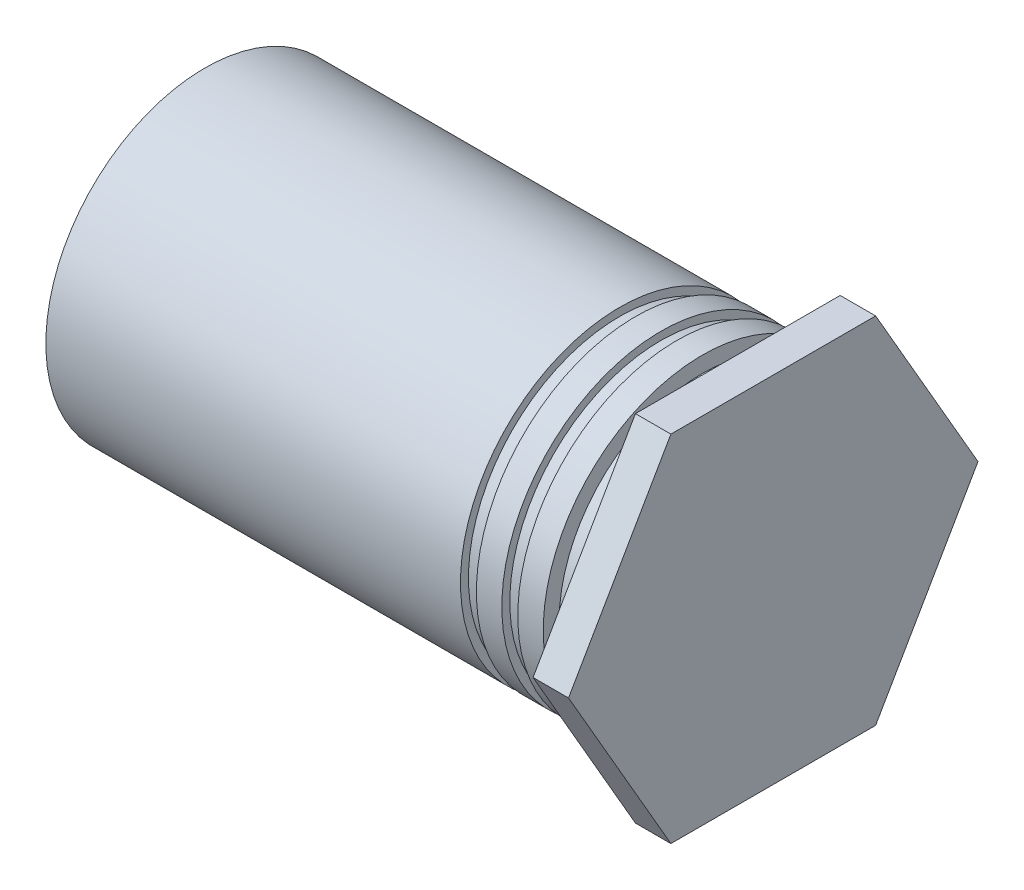
ISO-10303-21;
HEADER;
FILE_DESCRIPTION(('STEP AP214'),'2;1');
FILE_NAME('part.step','',(''),(''),'','','');
FILE_SCHEMA(('AUTOMOTIVE_DESIGN { 1 0 10303 214 1 1 1 1 }'));
ENDSEC;
DATA;
#1=APPLICATION_CONTEXT('core data for automotive mechanical design processes');
#2=APPLICATION_PROTOCOL_DEFINITION('international standard','automotive_design',2000,#1);
#3=PRODUCT_CONTEXT('',#1,'mechanical');
#4=PRODUCT('Part','Part','',(#3));
#5=PRODUCT_RELATED_PRODUCT_CATEGORY('part','',(#4));
#6=PRODUCT_DEFINITION_FORMATION('','',#4);
#7=PRODUCT_DEFINITION_CONTEXT('part definition',#1,'design');
#8=PRODUCT_DEFINITION('design','',#6,#7);
#9=PRODUCT_DEFINITION_SHAPE('','',#8);
#10=(LENGTH_UNIT() NAMED_UNIT(*) SI_UNIT(.MILLI.,.METRE.));
#11=(NAMED_UNIT(*) PLANE_ANGLE_UNIT() SI_UNIT($,.RADIAN.));
#12=(NAMED_UNIT(*) SI_UNIT($,.STERADIAN.) SOLID_ANGLE_UNIT());
#13=UNCERTAINTY_MEASURE_WITH_UNIT(LENGTH_MEASURE(1.E-05),#10,'distance_accuracy_value','');
#14=(GEOMETRIC_REPRESENTATION_CONTEXT(3) GLOBAL_UNCERTAINTY_ASSIGNED_CONTEXT((#13)) GLOBAL_UNIT_ASSIGNED_CONTEXT((#10,
#11,#12)) REPRESENTATION_CONTEXT('',''));
#15=CARTESIAN_POINT('',(0.,0.,0.));
#16=DIRECTION('',(0.,0.,1.));
#17=DIRECTION('',(1.,0.,0.));
#18=AXIS2_PLACEMENT_3D('',#15,#16,#17);
#19=CARTESIAN_POINT('',(0.79248,0.,0.));
#20=DIRECTION('',(1.,0.,0.));
#21=DIRECTION('',(0.,1.,0.));
#22=AXIS2_PLACEMENT_3D('',#19,#20,#21);
#23=PLANE('',#22);
#24=DIRECTION('',(0.,0.866025403784438,-0.500000000000001));
#25=VECTOR('',#24,1.);
#26=CARTESIAN_POINT('',(0.79248,-1.9812,-3.43153905995546));
#27=LINE('',#26,#25);
#28=CARTESIAN_POINT('',(0.79248,0.,-4.57538541327395));
#29=VERTEX_POINT('',#28);
#30=CARTESIAN_POINT('',(0.79248,-3.9624,-2.28769270663697));
#31=VERTEX_POINT('',#30);
#32=EDGE_CURVE('E83',#29,#31,#27,.F.);
#33=ORIENTED_EDGE('',*,*,#32,.F.);
#34=DIRECTION('',(0.,0.866025403784439,0.5));
#35=VECTOR('',#34,1.);
#36=CARTESIAN_POINT('',(0.792480000000001,1.9812,-3.43153905995546));
#37=LINE('',#36,#35);
#38=CARTESIAN_POINT('',(0.79248,3.9624,-2.28769270663698));
#39=VERTEX_POINT('',#38);
#40=EDGE_CURVE('E167',#39,#29,#37,.F.);
#41=ORIENTED_EDGE('',*,*,#40,.F.);
#42=DIRECTION('',(0.,0.,1.));
#43=VECTOR('',#42,1.);
#44=CARTESIAN_POINT('',(0.79248,3.9624,0.));
#45=LINE('',#44,#43);
#46=CARTESIAN_POINT('',(0.79248,3.9624,2.28769270663697));
#47=VERTEX_POINT('',#46);
#48=EDGE_CURVE('E161',#47,#39,#45,.F.);
#49=ORIENTED_EDGE('',*,*,#48,.F.);
#50=DIRECTION('',(0.,-0.866025403784439,0.5));
#51=VECTOR('',#50,1.);
#52=CARTESIAN_POINT('',(0.792480000000001,1.9812,3.43153905995546));
#53=LINE('',#52,#51);
#54=CARTESIAN_POINT('',(0.79248,0.,4.57538541327394));
#55=VERTEX_POINT('',#54);
#56=EDGE_CURVE('E72',#55,#47,#53,.F.);
#57=ORIENTED_EDGE('',*,*,#56,.F.);
#58=DIRECTION('',(0.,-0.866025403784439,-0.5));
#59=VECTOR('',#58,1.);
#60=CARTESIAN_POINT('',(0.792480000000001,-1.9812,3.43153905995546));
#61=LINE('',#60,#59);
#62=CARTESIAN_POINT('',(0.79248,-3.9624,2.28769270663697));
#63=VERTEX_POINT('',#62);
#64=EDGE_CURVE('E69',#63,#55,#61,.F.);
#65=ORIENTED_EDGE('',*,*,#64,.F.);
#66=DIRECTION('',(0.,0.,-1.));
#67=VECTOR('',#66,1.);
#68=CARTESIAN_POINT('',(0.79248,-3.9624,0.));
#69=LINE('',#68,#67);
#70=EDGE_CURVE('E66',#31,#63,#69,.F.);
#71=ORIENTED_EDGE('',*,*,#70,.F.);
#72=EDGE_LOOP('',(#33,#41,#49,#57,#65,#71));
#73=FACE_BOUND('',#72,.T.);
#74=ADVANCED_FACE('F17',(#73),#23,.T.);
#75=CARTESIAN_POINT('',(0.,-1.9812,3.43153905995546));
#76=DIRECTION('',(0.,-0.5,0.866025403784439));
#77=DIRECTION('',(0.,-0.866025403784439,-0.5));
#78=AXIS2_PLACEMENT_3D('',#75,#76,#77);
#79=PLANE('',#78);
#80=DIRECTION('',(0.,-0.866025403784439,-0.5));
#81=VECTOR('',#80,1.);
#82=CARTESIAN_POINT('',(0.,0.,4.57538541327394));
#83=LINE('',#82,#81);
#84=CARTESIAN_POINT('',(0.,0.,4.57538541327394));
#85=VERTEX_POINT('',#84);
#86=CARTESIAN_POINT('',(0.,-3.9624,2.28769270663697));
#87=VERTEX_POINT('',#86);
#88=EDGE_CURVE('E80',#85,#87,#83,.T.);
#89=ORIENTED_EDGE('',*,*,#88,.T.);
#90=DIRECTION('',(1.,0.,0.));
#91=VECTOR('',#90,1.);
#92=CARTESIAN_POINT('',(0.,-3.9624,2.28769270663697));
#93=LINE('',#92,#91);
#94=EDGE_CURVE('E77',#63,#87,#93,.F.);
#95=ORIENTED_EDGE('',*,*,#94,.F.);
#96=ORIENTED_EDGE('',*,*,#64,.T.);
#97=DIRECTION('',(1.,0.,0.));
#98=VECTOR('',#97,1.);
#99=CARTESIAN_POINT('',(0.,0.,4.57538541327394));
#100=LINE('',#99,#98);
#101=EDGE_CURVE('E153',#85,#55,#100,.T.);
#102=ORIENTED_EDGE('',*,*,#101,.F.);
#103=EDGE_LOOP('',(#89,#95,#96,#102));
#104=FACE_BOUND('',#103,.T.);
#105=ADVANCED_FACE('F78',(#104),#79,.T.);
#106=CARTESIAN_POINT('',(0.,-3.9624,0.));
#107=DIRECTION('',(0.,-1.,0.));
#108=DIRECTION('',(0.,0.,-1.));
#109=AXIS2_PLACEMENT_3D('',#106,#107,#108);
#110=PLANE('',#109);
#111=DIRECTION('',(0.,0.,1.));
#112=VECTOR('',#111,1.);
#113=CARTESIAN_POINT('',(0.,-3.9624,0.));
#114=LINE('',#113,#112);
#115=CARTESIAN_POINT('',(0.,-3.9624,-2.28769270663697));
#116=VERTEX_POINT('',#115);
#117=EDGE_CURVE('E150',#87,#116,#114,.F.);
#118=ORIENTED_EDGE('',*,*,#117,.T.);
#119=DIRECTION('',(1.,0.,0.));
#120=VECTOR('',#119,1.);
#121=CARTESIAN_POINT('',(0.,-3.9624,-2.28769270663697));
#122=LINE('',#121,#120);
#123=EDGE_CURVE('E87',#31,#116,#122,.F.);
#124=ORIENTED_EDGE('',*,*,#123,.F.);
#125=ORIENTED_EDGE('',*,*,#70,.T.);
#126=ORIENTED_EDGE('',*,*,#94,.T.);
#127=EDGE_LOOP('',(#118,#124,#125,#126));
#128=FACE_BOUND('',#127,.T.);
#129=ADVANCED_FACE('F85',(#128),#110,.T.);
#130=CARTESIAN_POINT('',(0.,-1.9812,-3.43153905995546));
#131=DIRECTION('',(0.,-0.500000000000001,-0.866025403784438));
#132=DIRECTION('',(0.,0.866025403784438,-0.500000000000001));
#133=AXIS2_PLACEMENT_3D('',#130,#131,#132);
#134=PLANE('',#133);
#135=DIRECTION('',(0.,0.866025403784438,-0.500000000000001));
#136=VECTOR('',#135,1.);
#137=CARTESIAN_POINT('',(0.,-3.9624,-2.28769270663697));
#138=LINE('',#137,#136);
#139=CARTESIAN_POINT('',(0.,0.,-4.57538541327395));
#140=VERTEX_POINT('',#139);
#141=EDGE_CURVE('E148',#116,#140,#138,.T.);
#142=ORIENTED_EDGE('',*,*,#141,.T.);
#143=DIRECTION('',(1.,0.,0.));
#144=VECTOR('',#143,1.);
#145=CARTESIAN_POINT('',(0.,0.,-4.57538541327395));
#146=LINE('',#145,#144);
#147=EDGE_CURVE('E164',#29,#140,#146,.F.);
#148=ORIENTED_EDGE('',*,*,#147,.F.);
#149=ORIENTED_EDGE('',*,*,#32,.T.);
#150=ORIENTED_EDGE('',*,*,#123,.T.);
#151=EDGE_LOOP('',(#142,#148,#149,#150));
#152=FACE_BOUND('',#151,.T.);
#153=ADVANCED_FACE('F172',(#152),#134,.T.);
#154=CARTESIAN_POINT('',(0.,1.9812,-3.43153905995546));
#155=DIRECTION('',(0.,0.5,-0.866025403784439));
#156=DIRECTION('',(0.,0.866025403784439,0.5));
#157=AXIS2_PLACEMENT_3D('',#154,#155,#156);
#158=PLANE('',#157);
#159=DIRECTION('',(0.,0.866025403784439,0.499999999999999));
#160=VECTOR('',#159,1.);
#161=CARTESIAN_POINT('',(0.,0.,-4.57538541327395));
#162=LINE('',#161,#160);
#163=CARTESIAN_POINT('',(0.,3.9624,-2.28769270663698));
#164=VERTEX_POINT('',#163);
#165=EDGE_CURVE('E142',#140,#164,#162,.T.);
#166=ORIENTED_EDGE('',*,*,#165,.T.);
#167=DIRECTION('',(1.,0.,0.));
#168=VECTOR('',#167,1.);
#169=CARTESIAN_POINT('',(0.,3.9624,-2.28769270663698));
#170=LINE('',#169,#168);
#171=EDGE_CURVE('E158',#39,#164,#170,.F.);
#172=ORIENTED_EDGE('',*,*,#171,.F.);
#173=ORIENTED_EDGE('',*,*,#40,.T.);
#174=ORIENTED_EDGE('',*,*,#147,.T.);
#175=EDGE_LOOP('',(#166,#172,#173,#174));
#176=FACE_BOUND('',#175,.T.);
#177=ADVANCED_FACE('F177',(#176),#158,.T.);
#178=CARTESIAN_POINT('',(0.,3.9624,0.));
#179=DIRECTION('',(0.,1.,0.));
#180=DIRECTION('',(0.,0.,1.));
#181=AXIS2_PLACEMENT_3D('',#178,#179,#180);
#182=PLANE('',#181);
#183=DIRECTION('',(0.,0.,1.));
#184=VECTOR('',#183,1.);
#185=CARTESIAN_POINT('',(0.,3.9624,0.));
#186=LINE('',#185,#184);
#187=CARTESIAN_POINT('',(0.,3.9624,2.28769270663697));
#188=VERTEX_POINT('',#187);
#189=EDGE_CURVE('E137',#164,#188,#186,.T.);
#190=ORIENTED_EDGE('',*,*,#189,.T.);
#191=DIRECTION('',(1.,0.,0.));
#192=VECTOR('',#191,1.);
#193=CARTESIAN_POINT('',(0.,3.9624,2.28769270663697));
#194=LINE('',#193,#192);
#195=EDGE_CURVE('E155',#47,#188,#194,.F.);
#196=ORIENTED_EDGE('',*,*,#195,.F.);
#197=ORIENTED_EDGE('',*,*,#48,.T.);
#198=ORIENTED_EDGE('',*,*,#171,.T.);
#199=EDGE_LOOP('',(#190,#196,#197,#198));
#200=FACE_BOUND('',#199,.T.);
#201=ADVANCED_FACE('F181',(#200),#182,.T.);
#202=CARTESIAN_POINT('',(0.,1.9812,3.43153905995546));
#203=DIRECTION('',(0.,0.5,0.866025403784439));
#204=DIRECTION('',(0.,-0.866025403784439,0.5));
#205=AXIS2_PLACEMENT_3D('',#202,#203,#204);
#206=PLANE('',#205);
#207=DIRECTION('',(0.,-0.866025403784439,0.5));
#208=VECTOR('',#207,1.);
#209=CARTESIAN_POINT('',(0.,3.9624,2.28769270663697));
#210=LINE('',#209,#208);
#211=EDGE_CURVE('E133',#188,#85,#210,.T.);
#212=ORIENTED_EDGE('',*,*,#211,.T.);
#213=ORIENTED_EDGE('',*,*,#101,.T.);
#214=ORIENTED_EDGE('',*,*,#56,.T.);
#215=ORIENTED_EDGE('',*,*,#195,.T.);
#216=EDGE_LOOP('',(#212,#213,#214,#215));
#217=FACE_BOUND('',#216,.T.);
#218=ADVANCED_FACE('F182',(#217),#206,.T.);
#219=CARTESIAN_POINT('',(0.,0.,0.));
#220=DIRECTION('',(1.,0.,0.));
#221=DIRECTION('',(0.,1.,0.));
#222=AXIS2_PLACEMENT_3D('',#219,#220,#221);
#223=PLANE('',#222);
#224=CARTESIAN_POINT('',(0.,0.,0.));
#225=DIRECTION('',(1.,0.,0.));
#226=DIRECTION('',(0.,0.,-1.));
#227=AXIS2_PLACEMENT_3D('',#224,#225,#226);
#228=CIRCLE('',#227,3.2004);
#229=CARTESIAN_POINT('',(0.,0.,-3.2004));
#230=VERTEX_POINT('',#229);
#231=EDGE_CURVE('E20',#230,#230,#228,.F.);
#232=ORIENTED_EDGE('',*,*,#231,.F.);
#233=EDGE_LOOP('',(#232));
#234=FACE_BOUND('',#233,.T.);
#235=ORIENTED_EDGE('',*,*,#189,.F.);
#236=ORIENTED_EDGE('',*,*,#165,.F.);
#237=ORIENTED_EDGE('',*,*,#141,.F.);
#238=ORIENTED_EDGE('',*,*,#117,.F.);
#239=ORIENTED_EDGE('',*,*,#88,.F.);
#240=ORIENTED_EDGE('',*,*,#211,.F.);
#241=EDGE_LOOP('',(#235,#236,#237,#238,#239,#240));
#242=FACE_BOUND('',#241,.T.);
#243=ADVANCED_FACE('F184',(#234,#242),#223,.F.);
#244=CARTESIAN_POINT('',(-0.39624,0.,0.));
#245=DIRECTION('',(1.,0.,0.));
#246=DIRECTION('',(0.,0.,-1.));
#247=AXIS2_PLACEMENT_3D('',#244,#245,#246);
#248=CYLINDRICAL_SURFACE('',#247,3.2004);
#249=CARTESIAN_POINT('',(-0.79248,0.,0.));
#250=DIRECTION('',(1.,0.,0.));
#251=DIRECTION('',(0.,0.,-1.));
#252=AXIS2_PLACEMENT_3D('',#249,#250,#251);
#253=CIRCLE('',#252,3.2004);
#254=CARTESIAN_POINT('',(-0.79248,0.,-3.2004));
#255=VERTEX_POINT('',#254);
#256=EDGE_CURVE('E128',#255,#255,#253,.F.);
#257=ORIENTED_EDGE('',*,*,#256,.F.);
#258=EDGE_LOOP('',(#257));
#259=FACE_BOUND('',#258,.T.);
#260=ORIENTED_EDGE('',*,*,#231,.T.);
#261=EDGE_LOOP('',(#260));
#262=FACE_BOUND('',#261,.T.);
#263=ADVANCED_FACE('F191',(#259,#262),#248,.T.);
#264=CARTESIAN_POINT('',(-0.79248,0.,1.778));
#265=DIRECTION('',(1.,0.,0.));
#266=DIRECTION('',(0.,0.,-1.));
#267=AXIS2_PLACEMENT_3D('',#264,#265,#266);
#268=PLANE('',#267);
#269=CARTESIAN_POINT('',(-0.79248,0.,0.));
#270=DIRECTION('',(1.,0.,0.));
#271=DIRECTION('',(0.,0.,-1.));
#272=AXIS2_PLACEMENT_3D('',#269,#270,#271);
#273=CIRCLE('',#272,3.556);
#274=CARTESIAN_POINT('',(-0.792479999999999,0.,-3.556));
#275=VERTEX_POINT('',#274);
#276=EDGE_CURVE('E126',#275,#275,#273,.F.);
#277=ORIENTED_EDGE('',*,*,#276,.F.);
#278=EDGE_LOOP('',(#277));
#279=FACE_BOUND('',#278,.T.);
#280=ORIENTED_EDGE('',*,*,#256,.T.);
#281=EDGE_LOOP('',(#280));
#282=FACE_BOUND('',#281,.T.);
#283=ADVANCED_FACE('F258',(#279,#282),#268,.T.);
#284=CARTESIAN_POINT('',(-6.35,0.,0.));
#285=DIRECTION('',(1.,0.,0.));
#286=DIRECTION('',(0.,0.,-1.));
#287=AXIS2_PLACEMENT_3D('',#284,#285,#286);
#288=CYLINDRICAL_SURFACE('',#287,3.556);
#289=CARTESIAN_POINT('',(-1.36144,0.,0.));
#290=DIRECTION('',(1.,0.,0.));
#291=DIRECTION('',(0.,0.,-1.));
#292=AXIS2_PLACEMENT_3D('',#289,#290,#291);
#293=CIRCLE('',#292,3.556);
#294=CARTESIAN_POINT('',(-1.36144,0.,-3.556));
#295=VERTEX_POINT('',#294);
#296=EDGE_CURVE('E123',#295,#295,#293,.T.);
#297=ORIENTED_EDGE('',*,*,#296,.T.);
#298=EDGE_LOOP('',(#297));
#299=FACE_BOUND('',#298,.T.);
#300=ORIENTED_EDGE('',*,*,#276,.T.);
#301=EDGE_LOOP('',(#300));
#302=FACE_BOUND('',#301,.T.);
#303=ADVANCED_FACE('F254',(#299,#302),#288,.T.);
#304=CARTESIAN_POINT('',(-1.36144,0.,3.4671));
#305=DIRECTION('',(1.,0.,0.));
#306=DIRECTION('',(0.,0.,-1.));
#307=AXIS2_PLACEMENT_3D('',#304,#305,#306);
#308=PLANE('',#307);
#309=ORIENTED_EDGE('',*,*,#296,.F.);
#310=EDGE_LOOP('',(#309));
#311=FACE_BOUND('',#310,.T.);
#312=CARTESIAN_POINT('',(-1.36144,0.,0.));
#313=DIRECTION('',(1.,0.,0.));
#314=DIRECTION('',(0.,0.,-1.));
#315=AXIS2_PLACEMENT_3D('',#312,#313,#314);
#316=CIRCLE('',#315,3.3782);
#317=CARTESIAN_POINT('',(-1.36144,0.,-3.3782));
#318=VERTEX_POINT('',#317);
#319=EDGE_CURVE('E120',#318,#318,#316,.F.);
#320=ORIENTED_EDGE('',*,*,#319,.F.);
#321=EDGE_LOOP('',(#320));
#322=FACE_BOUND('',#321,.T.);
#323=ADVANCED_FACE('F250',(#311,#322),#308,.F.);
#324=CARTESIAN_POINT('',(-1.53924,0.,0.));
#325=DIRECTION('',(1.,0.,0.));
#326=DIRECTION('',(0.,0.,-1.));
#327=AXIS2_PLACEMENT_3D('',#324,#325,#326);
#328=CYLINDRICAL_SURFACE('',#327,3.3782);
#329=CARTESIAN_POINT('',(-1.71704,0.,0.));
#330=DIRECTION('',(1.,0.,0.));
#331=DIRECTION('',(0.,0.,-1.));
#332=AXIS2_PLACEMENT_3D('',#329,#330,#331);
#333=CIRCLE('',#332,3.3782);
#334=CARTESIAN_POINT('',(-1.71704,0.,-3.3782));
#335=VERTEX_POINT('',#334);
#336=EDGE_CURVE('E117',#335,#335,#333,.T.);
#337=ORIENTED_EDGE('',*,*,#336,.T.);
#338=EDGE_LOOP('',(#337));
#339=FACE_BOUND('',#338,.T.);
#340=ORIENTED_EDGE('',*,*,#319,.T.);
#341=EDGE_LOOP('',(#340));
#342=FACE_BOUND('',#341,.T.);
#343=ADVANCED_FACE('F246',(#339,#342),#328,.T.);
#344=CARTESIAN_POINT('',(-2.38252000008288,0.,0.));
#345=DIRECTION('',(-1.,0.,0.));
#346=DIRECTION('',(0.,0.,1.));
#347=AXIS2_PLACEMENT_3D('',#344,#345,#346);
#348=CONICAL_SURFACE('',#347,1.61036000014292,1.04719755116926);
#349=CARTESIAN_POINT('',(-2.38252,0.,0.));
#350=DIRECTION('',(-1.,0.,0.));
#351=DIRECTION('',(0.,0.,1.));
#352=AXIS2_PLACEMENT_3D('',#349,#350,#351);
#353=CIRCLE('',#352,1.61036);
#354=CARTESIAN_POINT('',(-2.38252,0.,1.61036));
#355=VERTEX_POINT('',#354);
#356=EDGE_CURVE('E116',#355,#355,#353,.T.);
#357=ORIENTED_EDGE('',*,*,#356,.T.);
#358=EDGE_LOOP('',(#357));
#359=FACE_BOUND('',#358,.T.);
#360=CARTESIAN_POINT('',(-1.45277822051071,0.,-8.5265128291212E-11));
#361=VERTEX_POINT('',#360);
#362=VERTEX_LOOP('',#361);
#363=FACE_BOUND('',#362,.T.);
#364=ADVANCED_FACE('F242',(#359,#363),#348,.F.);
#365=CARTESIAN_POINT('',(-1.71704,0.,3.4671));
#366=DIRECTION('',(-1.,0.,0.));
#367=DIRECTION('',(0.,0.,1.));
#368=AXIS2_PLACEMENT_3D('',#365,#366,#367);
#369=PLANE('',#368);
#370=ORIENTED_EDGE('',*,*,#336,.F.);
#371=EDGE_LOOP('',(#370));
#372=FACE_BOUND('',#371,.T.);
#373=CARTESIAN_POINT('',(-1.71704,0.,0.));
#374=DIRECTION('',(1.,0.,0.));
#375=DIRECTION('',(0.,0.,-1.));
#376=AXIS2_PLACEMENT_3D('',#373,#374,#375);
#377=CIRCLE('',#376,3.556);
#378=CARTESIAN_POINT('',(-1.71704,0.,-3.556));
#379=VERTEX_POINT('',#378);
#380=EDGE_CURVE('E113',#379,#379,#377,.F.);
#381=ORIENTED_EDGE('',*,*,#380,.F.);
#382=EDGE_LOOP('',(#381));
#383=FACE_BOUND('',#382,.T.);
#384=ADVANCED_FACE('F238',(#372,#383),#369,.F.);
#385=CARTESIAN_POINT('',(-3.97002,0.,0.));
#386=DIRECTION('',(-1.,0.,0.));
#387=DIRECTION('',(0.,0.,1.));
#388=AXIS2_PLACEMENT_3D('',#385,#386,#387);
#389=CYLINDRICAL_SURFACE('',#388,1.61036);
#390=ORIENTED_EDGE('',*,*,#356,.F.);
#391=EDGE_LOOP('',(#390));
#392=FACE_BOUND('',#391,.T.);
#393=CARTESIAN_POINT('',(-5.55752,0.,0.));
#394=DIRECTION('',(-1.,0.,0.));
#395=DIRECTION('',(0.,0.,1.));
#396=AXIS2_PLACEMENT_3D('',#393,#394,#395);
#397=CIRCLE('',#396,1.61036);
#398=CARTESIAN_POINT('',(-5.55752,0.,1.61036));
#399=VERTEX_POINT('',#398);
#400=EDGE_CURVE('E110',#399,#399,#397,.T.);
#401=ORIENTED_EDGE('',*,*,#400,.T.);
#402=EDGE_LOOP('',(#401));
#403=FACE_BOUND('',#402,.T.);
#404=ADVANCED_FACE('F234',(#392,#403),#389,.F.);
#405=CARTESIAN_POINT('',(-6.35,0.,0.));
#406=DIRECTION('',(1.,0.,0.));
#407=DIRECTION('',(0.,0.,-1.));
#408=AXIS2_PLACEMENT_3D('',#405,#406,#407);
#409=CYLINDRICAL_SURFACE('',#408,3.556);
#410=CARTESIAN_POINT('',(-2.286,0.,0.));
#411=DIRECTION('',(1.,0.,0.));
#412=DIRECTION('',(0.,0.,-1.));
#413=AXIS2_PLACEMENT_3D('',#410,#411,#412);
#414=CIRCLE('',#413,3.556);
#415=CARTESIAN_POINT('',(-2.286,0.,-3.556));
#416=VERTEX_POINT('',#415);
#417=EDGE_CURVE('E107',#416,#416,#414,.T.);
#418=ORIENTED_EDGE('',*,*,#417,.T.);
#419=EDGE_LOOP('',(#418));
#420=FACE_BOUND('',#419,.T.);
#421=ORIENTED_EDGE('',*,*,#380,.T.);
#422=EDGE_LOOP('',(#421));
#423=FACE_BOUND('',#422,.T.);
#424=ADVANCED_FACE('F230',(#420,#423),#409,.T.);
#425=CARTESIAN_POINT('',(-5.55752,0.,-1.0414));
#426=DIRECTION('',(1.,0.,0.));
#427=DIRECTION('',(0.,1.,0.));
#428=AXIS2_PLACEMENT_3D('',#425,#426,#427);
#429=PLANE('',#428);
#430=ORIENTED_EDGE('',*,*,#400,.F.);
#431=EDGE_LOOP('',(#430));
#432=FACE_BOUND('',#431,.T.);
#433=CARTESIAN_POINT('',(-5.55752,0.,0.));
#434=DIRECTION('',(1.,0.,0.));
#435=DIRECTION('',(0.,1.,0.));
#436=AXIS2_PLACEMENT_3D('',#433,#434,#435);
#437=CIRCLE('',#436,1.65354);
#438=CARTESIAN_POINT('',(-5.55752,1.65354,0.));
#439=VERTEX_POINT('',#438);
#440=EDGE_CURVE('E104',#439,#439,#437,.F.);
#441=ORIENTED_EDGE('',*,*,#440,.T.);
#442=EDGE_LOOP('',(#441));
#443=FACE_BOUND('',#442,.T.);
#444=ADVANCED_FACE('F226',(#432,#443),#429,.F.);
#445=CARTESIAN_POINT('',(-2.286,0.,3.4671));
#446=DIRECTION('',(1.,0.,0.));
#447=DIRECTION('',(0.,0.,-1.));
#448=AXIS2_PLACEMENT_3D('',#445,#446,#447);
#449=PLANE('',#448);
#450=ORIENTED_EDGE('',*,*,#417,.F.);
#451=EDGE_LOOP('',(#450));
#452=FACE_BOUND('',#451,.T.);
#453=CARTESIAN_POINT('',(-2.286,0.,0.));
#454=DIRECTION('',(1.,0.,0.));
#455=DIRECTION('',(0.,0.,-1.));
#456=AXIS2_PLACEMENT_3D('',#453,#454,#455);
#457=CIRCLE('',#456,3.3782);
#458=CARTESIAN_POINT('',(-2.286,0.,-3.3782));
#459=VERTEX_POINT('',#458);
#460=EDGE_CURVE('E101',#459,#459,#457,.F.);
#461=ORIENTED_EDGE('',*,*,#460,.F.);
#462=EDGE_LOOP('',(#461));
#463=FACE_BOUND('',#462,.T.);
#464=ADVANCED_FACE('F222',(#452,#463),#449,.F.);
#465=CARTESIAN_POINT('',(-8.51789,0.,0.));
#466=DIRECTION('',(1.,0.,0.));
#467=DIRECTION('',(0.,1.,0.));
#468=AXIS2_PLACEMENT_3D('',#465,#466,#467);
#469=CYLINDRICAL_SURFACE('',#468,1.65354);
#470=ORIENTED_EDGE('',*,*,#440,.F.);
#471=EDGE_LOOP('',(#470));
#472=FACE_BOUND('',#471,.T.);
#473=CARTESIAN_POINT('',(-11.4782599999899,0.,0.));
#474=DIRECTION('',(-1.,0.,0.));
#475=DIRECTION('',(0.,0.,1.));
#476=AXIS2_PLACEMENT_3D('',#473,#474,#475);
#477=CIRCLE('',#476,1.65354000000661);
#478=CARTESIAN_POINT('',(-11.4782599999899,0.,1.65354000000661));
#479=VERTEX_POINT('',#478);
#480=EDGE_CURVE('E100',#479,#479,#477,.T.);
#481=ORIENTED_EDGE('',*,*,#480,.T.);
#482=EDGE_LOOP('',(#481));
#483=FACE_BOUND('',#482,.T.);
#484=ADVANCED_FACE('F218',(#472,#483),#469,.F.);
#485=CARTESIAN_POINT('',(-2.4638,0.,0.));
#486=DIRECTION('',(1.,0.,0.));
#487=DIRECTION('',(0.,0.,-1.));
#488=AXIS2_PLACEMENT_3D('',#485,#486,#487);
#489=CYLINDRICAL_SURFACE('',#488,3.3782);
#490=CARTESIAN_POINT('',(-2.6416,0.,0.));
#491=DIRECTION('',(1.,0.,0.));
#492=DIRECTION('',(0.,0.,-1.));
#493=AXIS2_PLACEMENT_3D('',#490,#491,#492);
#494=CIRCLE('',#493,3.3782);
#495=CARTESIAN_POINT('',(-2.6416,0.,-3.3782));
#496=VERTEX_POINT('',#495);
#497=EDGE_CURVE('E97',#496,#496,#494,.T.);
#498=ORIENTED_EDGE('',*,*,#497,.T.);
#499=EDGE_LOOP('',(#498));
#500=FACE_BOUND('',#499,.T.);
#501=ORIENTED_EDGE('',*,*,#460,.T.);
#502=EDGE_LOOP('',(#501));
#503=FACE_BOUND('',#502,.T.);
#504=ADVANCED_FACE('F214',(#500,#503),#489,.T.);
#505=CARTESIAN_POINT('',(-11.907519999852,0.,0.));
#506=DIRECTION('',(-1.,0.,0.));
#507=DIRECTION('',(0.,-1.,0.));
#508=AXIS2_PLACEMENT_3D('',#505,#506,#507);
#509=CONICAL_SURFACE('',#508,2.08279999986871,0.785398163397448);
#510=ORIENTED_EDGE('',*,*,#480,.F.);
#511=EDGE_LOOP('',(#510));
#512=FACE_BOUND('',#511,.T.);
#513=CARTESIAN_POINT('',(-11.9075199999656,0.,0.));
#514=DIRECTION('',(-1.,0.,0.));
#515=DIRECTION('',(0.,-1.,0.));
#516=AXIS2_PLACEMENT_3D('',#513,#514,#515);
#517=CIRCLE('',#516,2.0827999999824);
#518=CARTESIAN_POINT('',(-11.9075199999656,-2.0827999999824,0.));
#519=VERTEX_POINT('',#518);
#520=EDGE_CURVE('E94',#519,#519,#517,.F.);
#521=ORIENTED_EDGE('',*,*,#520,.F.);
#522=EDGE_LOOP('',(#521));
#523=FACE_BOUND('',#522,.T.);
#524=ADVANCED_FACE('F210',(#512,#523),#509,.F.);
#525=CARTESIAN_POINT('',(-2.6416,0.,3.4671));
#526=DIRECTION('',(-1.,0.,0.));
#527=DIRECTION('',(0.,0.,1.));
#528=AXIS2_PLACEMENT_3D('',#525,#526,#527);
#529=PLANE('',#528);
#530=ORIENTED_EDGE('',*,*,#497,.F.);
#531=EDGE_LOOP('',(#530));
#532=FACE_BOUND('',#531,.T.);
#533=CARTESIAN_POINT('',(-2.6416,0.,0.));
#534=DIRECTION('',(1.,0.,0.));
#535=DIRECTION('',(0.,0.,-1.));
#536=AXIS2_PLACEMENT_3D('',#533,#534,#535);
#537=CIRCLE('',#536,3.556);
#538=CARTESIAN_POINT('',(-2.6416,0.,-3.556));
#539=VERTEX_POINT('',#538);
#540=EDGE_CURVE('E26',#539,#539,#537,.F.);
#541=ORIENTED_EDGE('',*,*,#540,.F.);
#542=EDGE_LOOP('',(#541));
#543=FACE_BOUND('',#542,.T.);
#544=ADVANCED_FACE('F203',(#532,#543),#529,.F.);
#545=CARTESIAN_POINT('',(-11.90752,0.,1.778));
#546=DIRECTION('',(-1.,0.,0.));
#547=DIRECTION('',(0.,0.,1.));
#548=AXIS2_PLACEMENT_3D('',#545,#546,#547);
#549=PLANE('',#548);
#550=CARTESIAN_POINT('',(-11.90752,0.,0.));
#551=DIRECTION('',(1.,0.,0.));
#552=DIRECTION('',(0.,0.,-1.));
#553=AXIS2_PLACEMENT_3D('',#550,#551,#552);
#554=CIRCLE('',#553,3.556);
#555=CARTESIAN_POINT('',(-11.90752,0.,-3.556));
#556=VERTEX_POINT('',#555);
#557=EDGE_CURVE('E11',#556,#556,#554,.T.);
#558=ORIENTED_EDGE('',*,*,#557,.F.);
#559=EDGE_LOOP('',(#558));
#560=FACE_BOUND('',#559,.T.);
#561=ORIENTED_EDGE('',*,*,#520,.T.);
#562=EDGE_LOOP('',(#561));
#563=FACE_BOUND('',#562,.T.);
#564=ADVANCED_FACE('F197',(#560,#563),#549,.T.);
#565=CARTESIAN_POINT('',(-6.35,0.,0.));
#566=DIRECTION('',(1.,0.,0.));
#567=DIRECTION('',(0.,0.,-1.));
#568=AXIS2_PLACEMENT_3D('',#565,#566,#567);
#569=CYLINDRICAL_SURFACE('',#568,3.556);
#570=ORIENTED_EDGE('',*,*,#540,.T.);
#571=EDGE_LOOP('',(#570));
#572=FACE_BOUND('',#571,.T.);
#573=ORIENTED_EDGE('',*,*,#557,.T.);
#574=EDGE_LOOP('',(#573));
#575=FACE_BOUND('',#574,.T.);
#576=ADVANCED_FACE('F195',(#572,#575),#569,.T.);
#577=CLOSED_SHELL('',(#74,#105,#129,#153,#177,#201,#218,#243,#263,#283,#303,#323,#343,#364,#384,
#404,#424,#444,#464,#484,#504,#524,#544,#564,#576));
#578=MANIFOLD_SOLID_BREP('B1',#577);
#579=ADVANCED_BREP_SHAPE_REPRESENTATION('',(#18,#578),#14);
#580=SHAPE_DEFINITION_REPRESENTATION(#9,#579);
ENDSEC;
END-ISO-10303-21;
